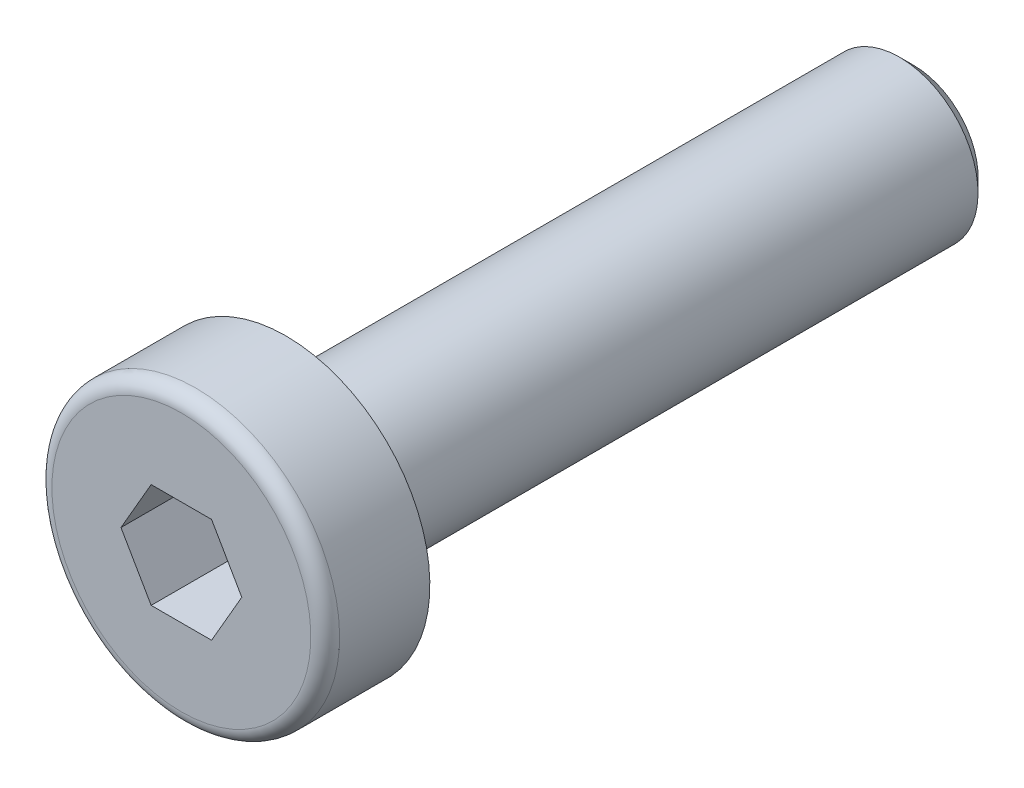
ISO-10303-21;
HEADER;
FILE_DESCRIPTION(('STEP AP214'),'2;1');
FILE_NAME('part.step','',(''),(''),'','','');
FILE_SCHEMA(('AUTOMOTIVE_DESIGN { 1 0 10303 214 1 1 1 1 }'));
ENDSEC;
DATA;
#1=APPLICATION_CONTEXT('core data for automotive mechanical design processes');
#2=APPLICATION_PROTOCOL_DEFINITION('international standard','automotive_design',2000,#1);
#3=PRODUCT_CONTEXT('',#1,'mechanical');
#4=PRODUCT('Part','Part','',(#3));
#5=PRODUCT_RELATED_PRODUCT_CATEGORY('part','',(#4));
#6=PRODUCT_DEFINITION_FORMATION('','',#4);
#7=PRODUCT_DEFINITION_CONTEXT('part definition',#1,'design');
#8=PRODUCT_DEFINITION('design','',#6,#7);
#9=PRODUCT_DEFINITION_SHAPE('','',#8);
#10=(LENGTH_UNIT() NAMED_UNIT(*) SI_UNIT(.MILLI.,.METRE.));
#11=(NAMED_UNIT(*) PLANE_ANGLE_UNIT() SI_UNIT($,.RADIAN.));
#12=(NAMED_UNIT(*) SI_UNIT($,.STERADIAN.) SOLID_ANGLE_UNIT());
#13=UNCERTAINTY_MEASURE_WITH_UNIT(LENGTH_MEASURE(1.E-05),#10,'distance_accuracy_value','');
#14=(GEOMETRIC_REPRESENTATION_CONTEXT(3) GLOBAL_UNCERTAINTY_ASSIGNED_CONTEXT((#13)) GLOBAL_UNIT_ASSIGNED_CONTEXT((#10,
#11,#12)) REPRESENTATION_CONTEXT('',''));
#15=CARTESIAN_POINT('',(0.,0.,0.));
#16=DIRECTION('',(0.,0.,1.));
#17=DIRECTION('',(1.,0.,0.));
#18=AXIS2_PLACEMENT_3D('',#15,#16,#17);
#19=CARTESIAN_POINT('',(0.,1.2375,2.));
#20=DIRECTION('',(0.,0.,1.));
#21=DIRECTION('',(0.,-1.,0.));
#22=AXIS2_PLACEMENT_3D('',#19,#20,#21);
#23=PLANE('',#22);
#24=CARTESIAN_POINT('',(0.,0.,2.));
#25=DIRECTION('',(0.,0.,-1.));
#26=DIRECTION('',(0.,1.,0.));
#27=AXIS2_PLACEMENT_3D('',#24,#25,#26);
#28=CIRCLE('',#27,2.475);
#29=CARTESIAN_POINT('',(0.,2.475,2.));
#30=VERTEX_POINT('',#29);
#31=EDGE_CURVE('E182',#30,#30,#28,.T.);
#32=ORIENTED_EDGE('',*,*,#31,.F.);
#33=EDGE_LOOP('',(#32));
#34=FACE_BOUND('',#33,.T.);
#35=DIRECTION('',(-0.5,0.866025403784439,0.));
#36=VECTOR('',#35,1.);
#37=CARTESIAN_POINT('',(-1.13395160929581,-0.0359372668749457,2.));
#38=LINE('',#37,#36);
#39=CARTESIAN_POINT('',(-0.57735,-0.999999533749891,2.));
#40=VERTEX_POINT('',#39);
#41=CARTESIAN_POINT('',(-1.1547,0.,2.));
#42=VERTEX_POINT('',#41);
#43=EDGE_CURVE('E105',#40,#42,#38,.T.);
#44=ORIENTED_EDGE('',*,*,#43,.T.);
#45=DIRECTION('',(0.5,0.866025403784439,0.));
#46=VECTOR('',#45,1.);
#47=CARTESIAN_POINT('',(-0.59809839070419,0.964062266874946,2.));
#48=LINE('',#47,#46);
#49=CARTESIAN_POINT('',(-0.57735,0.999999533749891,2.));
#50=VERTEX_POINT('',#49);
#51=EDGE_CURVE('E178',#42,#50,#48,.T.);
#52=ORIENTED_EDGE('',*,*,#51,.T.);
#53=DIRECTION('',(1.,0.,0.));
#54=VECTOR('',#53,1.);
#55=CARTESIAN_POINT('',(0.,0.999999533749891,2.));
#56=LINE('',#55,#54);
#57=CARTESIAN_POINT('',(0.57735,0.999999533749891,2.));
#58=VERTEX_POINT('',#57);
#59=EDGE_CURVE('E174',#50,#58,#56,.T.);
#60=ORIENTED_EDGE('',*,*,#59,.T.);
#61=DIRECTION('',(0.5,-0.866025403784439,0.));
#62=VECTOR('',#61,1.);
#63=CARTESIAN_POINT('',(0.598098390704189,0.964062266874946,2.));
#64=LINE('',#63,#62);
#65=CARTESIAN_POINT('',(1.1547,0.,2.));
#66=VERTEX_POINT('',#65);
#67=EDGE_CURVE('E170',#58,#66,#64,.T.);
#68=ORIENTED_EDGE('',*,*,#67,.T.);
#69=DIRECTION('',(-0.5,-0.866025403784439,0.));
#70=VECTOR('',#69,1.);
#71=CARTESIAN_POINT('',(1.13395160929581,-0.0359372668749458,2.));
#72=LINE('',#71,#70);
#73=CARTESIAN_POINT('',(0.57735,-0.999999533749891,2.));
#74=VERTEX_POINT('',#73);
#75=EDGE_CURVE('E108',#66,#74,#72,.T.);
#76=ORIENTED_EDGE('',*,*,#75,.T.);
#77=DIRECTION('',(-1.,0.,0.));
#78=VECTOR('',#77,1.);
#79=CARTESIAN_POINT('',(0.,-0.999999533749891,2.));
#80=LINE('',#79,#78);
#81=EDGE_CURVE('E140',#74,#40,#80,.T.);
#82=ORIENTED_EDGE('',*,*,#81,.T.);
#83=EDGE_LOOP('',(#44,#52,#60,#68,#76,#82));
#84=FACE_BOUND('',#83,.T.);
#85=ADVANCED_FACE('F17',(#34,#84),#23,.T.);
#86=CARTESIAN_POINT('',(0.,0.6146875,-12.));
#87=DIRECTION('',(0.,0.,-1.));
#88=DIRECTION('',(0.,1.,0.));
#89=AXIS2_PLACEMENT_3D('',#86,#87,#88);
#90=PLANE('',#89);
#91=CARTESIAN_POINT('',(0.,0.,-12.));
#92=DIRECTION('',(0.,0.,-1.));
#93=DIRECTION('',(0.,1.,0.));
#94=AXIS2_PLACEMENT_3D('',#91,#92,#93);
#95=CIRCLE('',#94,1.229375);
#96=CARTESIAN_POINT('',(0.,1.229375,-12.));
#97=VERTEX_POINT('',#96);
#98=EDGE_CURVE('E11',#97,#97,#95,.T.);
#99=ORIENTED_EDGE('',*,*,#98,.T.);
#100=EDGE_LOOP('',(#99));
#101=FACE_BOUND('',#100,.T.);
#102=ADVANCED_FACE('F210',(#101),#90,.T.);
#103=CARTESIAN_POINT('',(0.,0.,-11.8646875));
#104=DIRECTION('',(0.,0.,1.));
#105=DIRECTION('',(0.,1.,0.));
#106=AXIS2_PLACEMENT_3D('',#103,#104,#105);
#107=CONICAL_SURFACE('',#106,1.3646875,0.78539816339745);
#108=CARTESIAN_POINT('',(0.,0.,-11.729375));
#109=DIRECTION('',(0.,0.,-1.));
#110=DIRECTION('',(0.,1.,0.));
#111=AXIS2_PLACEMENT_3D('',#108,#109,#110);
#112=CIRCLE('',#111,1.5);
#113=CARTESIAN_POINT('',(0.,1.5,-11.729375));
#114=VERTEX_POINT('',#113);
#115=EDGE_CURVE('E24',#114,#114,#112,.T.);
#116=ORIENTED_EDGE('',*,*,#115,.T.);
#117=EDGE_LOOP('',(#116));
#118=FACE_BOUND('',#117,.T.);
#119=ORIENTED_EDGE('',*,*,#98,.F.);
#120=EDGE_LOOP('',(#119));
#121=FACE_BOUND('',#120,.T.);
#122=ADVANCED_FACE('F215',(#118,#121),#107,.T.);
#123=CARTESIAN_POINT('',(0.,0.,-5.9396875));
#124=DIRECTION('',(0.,0.,1.));
#125=DIRECTION('',(0.,1.,0.));
#126=AXIS2_PLACEMENT_3D('',#123,#124,#125);
#127=CYLINDRICAL_SURFACE('',#126,1.5);
#128=ORIENTED_EDGE('',*,*,#115,.F.);
#129=EDGE_LOOP('',(#128));
#130=FACE_BOUND('',#129,.T.);
#131=CARTESIAN_POINT('',(0.,0.,-0.623736249798327));
#132=DIRECTION('',(0.,0.,-1.));
#133=DIRECTION('',(0.,1.,0.));
#134=AXIS2_PLACEMENT_3D('',#131,#132,#133);
#135=CIRCLE('',#134,1.5);
#136=CARTESIAN_POINT('',(0.,1.5,-0.623736249798327));
#137=VERTEX_POINT('',#136);
#138=EDGE_CURVE('E99',#137,#137,#135,.T.);
#139=ORIENTED_EDGE('',*,*,#138,.T.);
#140=EDGE_LOOP('',(#139));
#141=FACE_BOUND('',#140,.T.);
#142=ADVANCED_FACE('F205',(#130,#141),#127,.T.);
#143=CARTESIAN_POINT('',(0.,0.,-0.15));
#144=DIRECTION('',(0.,0.,-1.));
#145=DIRECTION('',(-1.,0.,0.));
#146=AXIS2_PLACEMENT_3D('',#143,#144,#145);
#147=TOROIDAL_SURFACE('',#146,1.65,0.15);
#148=CARTESIAN_POINT('',(0.,0.,0.));
#149=DIRECTION('',(0.,0.,-1.));
#150=DIRECTION('',(0.,1.,0.));
#151=AXIS2_PLACEMENT_3D('',#148,#149,#150);
#152=CIRCLE('',#151,1.65);
#153=CARTESIAN_POINT('',(0.,1.65,0.));
#154=VERTEX_POINT('',#153);
#155=EDGE_CURVE('E186',#154,#154,#152,.T.);
#156=ORIENTED_EDGE('',*,*,#155,.T.);
#157=EDGE_LOOP('',(#156));
#158=FACE_BOUND('',#157,.T.);
#159=CARTESIAN_POINT('',(0.,0.,-0.15));
#160=DIRECTION('',(0.,0.,-1.));
#161=DIRECTION('',(0.,1.,0.));
#162=AXIS2_PLACEMENT_3D('',#159,#160,#161);
#163=CIRCLE('',#162,1.5);
#164=CARTESIAN_POINT('',(0.,1.5,-0.15));
#165=VERTEX_POINT('',#164);
#166=EDGE_CURVE('E113',#165,#165,#163,.T.);
#167=ORIENTED_EDGE('',*,*,#166,.F.);
#168=EDGE_LOOP('',(#167));
#169=FACE_BOUND('',#168,.T.);
#170=ADVANCED_FACE('F189',(#158,#169),#147,.F.);
#171=CARTESIAN_POINT('',(0.,2.2,0.));
#172=DIRECTION('',(0.,0.,-1.));
#173=DIRECTION('',(0.,1.,0.));
#174=AXIS2_PLACEMENT_3D('',#171,#172,#173);
#175=PLANE('',#174);
#176=CARTESIAN_POINT('',(0.,0.,0.));
#177=DIRECTION('',(0.,0.,-1.));
#178=DIRECTION('',(0.,1.,0.));
#179=AXIS2_PLACEMENT_3D('',#176,#177,#178);
#180=CIRCLE('',#179,2.75);
#181=CARTESIAN_POINT('',(0.,2.75,0.));
#182=VERTEX_POINT('',#181);
#183=EDGE_CURVE('E184',#182,#182,#180,.T.);
#184=ORIENTED_EDGE('',*,*,#183,.T.);
#185=EDGE_LOOP('',(#184));
#186=FACE_BOUND('',#185,.T.);
#187=ORIENTED_EDGE('',*,*,#155,.F.);
#188=EDGE_LOOP('',(#187));
#189=FACE_BOUND('',#188,.T.);
#190=ADVANCED_FACE('F192',(#186,#189),#175,.T.);
#191=CARTESIAN_POINT('',(0.,0.,0.8625));
#192=DIRECTION('',(0.,0.,1.));
#193=DIRECTION('',(0.,1.,0.));
#194=AXIS2_PLACEMENT_3D('',#191,#192,#193);
#195=CYLINDRICAL_SURFACE('',#194,2.75);
#196=CARTESIAN_POINT('',(0.,0.,1.725));
#197=DIRECTION('',(0.,0.,-1.));
#198=DIRECTION('',(0.,1.,0.));
#199=AXIS2_PLACEMENT_3D('',#196,#197,#198);
#200=CIRCLE('',#199,2.75);
#201=CARTESIAN_POINT('',(0.,2.75,1.725));
#202=VERTEX_POINT('',#201);
#203=EDGE_CURVE('E180',#202,#202,#200,.T.);
#204=ORIENTED_EDGE('',*,*,#203,.T.);
#205=EDGE_LOOP('',(#204));
#206=FACE_BOUND('',#205,.T.);
#207=ORIENTED_EDGE('',*,*,#183,.F.);
#208=EDGE_LOOP('',(#207));
#209=FACE_BOUND('',#208,.T.);
#210=ADVANCED_FACE('F194',(#206,#209),#195,.T.);
#211=CARTESIAN_POINT('',(0.,0.,1.725));
#212=DIRECTION('',(0.,0.,-1.));
#213=DIRECTION('',(-1.,0.,0.));
#214=AXIS2_PLACEMENT_3D('',#211,#212,#213);
#215=TOROIDAL_SURFACE('',#214,2.475,0.275);
#216=ORIENTED_EDGE('',*,*,#31,.T.);
#217=EDGE_LOOP('',(#216));
#218=FACE_BOUND('',#217,.T.);
#219=ORIENTED_EDGE('',*,*,#203,.F.);
#220=EDGE_LOOP('',(#219));
#221=FACE_BOUND('',#220,.T.);
#222=ADVANCED_FACE('F202',(#218,#221),#215,.T.);
#223=CARTESIAN_POINT('',(-0.866025,0.499999766874945,2.));
#224=DIRECTION('',(-0.866025403784439,0.5,0.));
#225=DIRECTION('',(0.5,0.866025403784439,0.));
#226=AXIS2_PLACEMENT_3D('',#223,#224,#225);
#227=PLANE('',#226);
#228=CARTESIAN_POINT('',(-1.1547,0.,0.5));
#229=CARTESIAN_POINT('',(-0.866025,0.499999766874946,0.333333411041685));
#230=CARTESIAN_POINT('',(-0.57735,0.999999533749891,0.5));
#231=(BOUNDED_CURVE() B_SPLINE_CURVE(2,(#228,#229,#230),.UNSPECIFIED.,.F.,
.F.) B_SPLINE_CURVE_WITH_KNOTS((3,3),(0.,1.16843559329444),
.UNSPECIFIED.) CURVE() GEOMETRIC_REPRESENTATION_ITEM() RATIONAL_B_SPLINE_CURVE((1.,
1.15470053837925,1.)) REPRESENTATION_ITEM(''));
#232=CARTESIAN_POINT('',(-1.1547,0.,0.5));
#233=VERTEX_POINT('',#232);
#234=CARTESIAN_POINT('',(-0.57735,0.999999533749891,0.5));
#235=VERTEX_POINT('',#234);
#236=EDGE_CURVE('E139',#233,#235,#231,.T.);
#237=ORIENTED_EDGE('',*,*,#236,.T.);
#238=DIRECTION('',(0.,0.,-1.));
#239=VECTOR('',#238,1.);
#240=CARTESIAN_POINT('',(-0.57735,0.999999533749891,2.));
#241=LINE('',#240,#239);
#242=EDGE_CURVE('E176',#50,#235,#241,.T.);
#243=ORIENTED_EDGE('',*,*,#242,.F.);
#244=ORIENTED_EDGE('',*,*,#51,.F.);
#245=DIRECTION('',(0.,0.,-1.));
#246=VECTOR('',#245,1.);
#247=CARTESIAN_POINT('',(-1.1547,0.,2.));
#248=LINE('',#247,#246);
#249=EDGE_CURVE('E104',#42,#233,#248,.T.);
#250=ORIENTED_EDGE('',*,*,#249,.T.);
#251=EDGE_LOOP('',(#237,#243,#244,#250));
#252=FACE_BOUND('',#251,.T.);
#253=ADVANCED_FACE('F228',(#252),#227,.F.);
#254=CARTESIAN_POINT('',(0.,0.999999533749891,2.));
#255=DIRECTION('',(0.,1.,0.));
#256=DIRECTION('',(1.,0.,0.));
#257=AXIS2_PLACEMENT_3D('',#254,#255,#256);
#258=PLANE('',#257);
#259=CARTESIAN_POINT('',(-0.57735,0.999999533749891,0.5));
#260=CARTESIAN_POINT('',(0.,0.999999533749893,0.333333411041685));
#261=CARTESIAN_POINT('',(0.57735,0.999999533749891,0.5));
#262=(BOUNDED_CURVE() B_SPLINE_CURVE(2,(#259,#260,#261),.UNSPECIFIED.,.F.,
.F.) B_SPLINE_CURVE_WITH_KNOTS((3,3),(0.,1.16843559329444),
.UNSPECIFIED.) CURVE() GEOMETRIC_REPRESENTATION_ITEM() RATIONAL_B_SPLINE_CURVE((1.,
1.15470053837925,1.)) REPRESENTATION_ITEM(''));
#263=CARTESIAN_POINT('',(0.57735,0.999999533749891,0.5));
#264=VERTEX_POINT('',#263);
#265=EDGE_CURVE('E123',#235,#264,#262,.T.);
#266=ORIENTED_EDGE('',*,*,#265,.T.);
#267=DIRECTION('',(0.,0.,-1.));
#268=VECTOR('',#267,1.);
#269=CARTESIAN_POINT('',(0.57735,0.999999533749891,2.));
#270=LINE('',#269,#268);
#271=EDGE_CURVE('E172',#58,#264,#270,.T.);
#272=ORIENTED_EDGE('',*,*,#271,.F.);
#273=ORIENTED_EDGE('',*,*,#59,.F.);
#274=ORIENTED_EDGE('',*,*,#242,.T.);
#275=EDGE_LOOP('',(#266,#272,#273,#274));
#276=FACE_BOUND('',#275,.T.);
#277=ADVANCED_FACE('F233',(#276),#258,.F.);
#278=CARTESIAN_POINT('',(0.866025,0.499999766874946,2.));
#279=DIRECTION('',(0.866025403784439,0.5,0.));
#280=DIRECTION('',(0.5,-0.866025403784439,0.));
#281=AXIS2_PLACEMENT_3D('',#278,#279,#280);
#282=PLANE('',#281);
#283=CARTESIAN_POINT('',(0.57735,0.999999533749891,0.5));
#284=CARTESIAN_POINT('',(0.866025,0.499999766874946,0.333333411041685));
#285=CARTESIAN_POINT('',(1.1547,0.,0.5));
#286=(BOUNDED_CURVE() B_SPLINE_CURVE(2,(#283,#284,#285),.UNSPECIFIED.,.F.,
.F.) B_SPLINE_CURVE_WITH_KNOTS((3,3),(0.,1.16843559329444),
.UNSPECIFIED.) CURVE() GEOMETRIC_REPRESENTATION_ITEM() RATIONAL_B_SPLINE_CURVE((1.,
1.15470053837925,1.)) REPRESENTATION_ITEM(''));
#287=CARTESIAN_POINT('',(1.1547,0.,0.5));
#288=VERTEX_POINT('',#287);
#289=EDGE_CURVE('E115',#264,#288,#286,.T.);
#290=ORIENTED_EDGE('',*,*,#289,.T.);
#291=DIRECTION('',(0.,0.,-1.));
#292=VECTOR('',#291,1.);
#293=CARTESIAN_POINT('',(1.1547,0.,2.));
#294=LINE('',#293,#292);
#295=EDGE_CURVE('E110',#66,#288,#294,.T.);
#296=ORIENTED_EDGE('',*,*,#295,.F.);
#297=ORIENTED_EDGE('',*,*,#67,.F.);
#298=ORIENTED_EDGE('',*,*,#271,.T.);
#299=EDGE_LOOP('',(#290,#296,#297,#298));
#300=FACE_BOUND('',#299,.T.);
#301=ADVANCED_FACE('F239',(#300),#282,.F.);
#302=CARTESIAN_POINT('',(0.866025,-0.499999766874946,2.));
#303=DIRECTION('',(0.866025403784439,-0.5,0.));
#304=DIRECTION('',(-0.5,-0.866025403784439,0.));
#305=AXIS2_PLACEMENT_3D('',#302,#303,#304);
#306=PLANE('',#305);
#307=CARTESIAN_POINT('',(1.1547,0.,0.5));
#308=CARTESIAN_POINT('',(0.866025,-0.499999766874945,0.333333411041685));
#309=CARTESIAN_POINT('',(0.57735,-0.999999533749891,0.5));
#310=(BOUNDED_CURVE() B_SPLINE_CURVE(2,(#307,#308,#309),.UNSPECIFIED.,.F.,
.F.) B_SPLINE_CURVE_WITH_KNOTS((3,3),(0.,1.16843559329444),
.UNSPECIFIED.) CURVE() GEOMETRIC_REPRESENTATION_ITEM() RATIONAL_B_SPLINE_CURVE((1.,
1.15470053837925,1.)) REPRESENTATION_ITEM(''));
#311=CARTESIAN_POINT('',(0.57735,-0.999999533749891,0.5));
#312=VERTEX_POINT('',#311);
#313=EDGE_CURVE('E106',#288,#312,#310,.T.);
#314=ORIENTED_EDGE('',*,*,#313,.T.);
#315=DIRECTION('',(0.,0.,-1.));
#316=VECTOR('',#315,1.);
#317=CARTESIAN_POINT('',(0.57735,-0.999999533749891,2.));
#318=LINE('',#317,#316);
#319=EDGE_CURVE('E111',#74,#312,#318,.T.);
#320=ORIENTED_EDGE('',*,*,#319,.F.);
#321=ORIENTED_EDGE('',*,*,#75,.F.);
#322=ORIENTED_EDGE('',*,*,#295,.T.);
#323=EDGE_LOOP('',(#314,#320,#321,#322));
#324=FACE_BOUND('',#323,.T.);
#325=ADVANCED_FACE('F243',(#324),#306,.F.);
#326=CARTESIAN_POINT('',(0.,-0.999999533749891,2.));
#327=DIRECTION('',(0.,-1.,0.));
#328=DIRECTION('',(-1.,0.,0.));
#329=AXIS2_PLACEMENT_3D('',#326,#327,#328);
#330=PLANE('',#329);
#331=CARTESIAN_POINT('',(0.57735,-0.999999533749891,0.5));
#332=CARTESIAN_POINT('',(0.,-0.999999533749893,0.333333411041685));
#333=CARTESIAN_POINT('',(-0.57735,-0.999999533749891,0.5));
#334=(BOUNDED_CURVE() B_SPLINE_CURVE(2,(#331,#332,#333),.UNSPECIFIED.,.F.,
.F.) B_SPLINE_CURVE_WITH_KNOTS((3,3),(0.,1.16843559329444),
.UNSPECIFIED.) CURVE() GEOMETRIC_REPRESENTATION_ITEM() RATIONAL_B_SPLINE_CURVE((1.,
1.15470053837925,1.)) REPRESENTATION_ITEM(''));
#335=CARTESIAN_POINT('',(-0.57735,-0.999999533749892,0.5));
#336=VERTEX_POINT('',#335);
#337=EDGE_CURVE('E131',#312,#336,#334,.T.);
#338=ORIENTED_EDGE('',*,*,#337,.T.);
#339=DIRECTION('',(0.,0.,-1.));
#340=VECTOR('',#339,1.);
#341=CARTESIAN_POINT('',(-0.57735,-0.999999533749891,2.));
#342=LINE('',#341,#340);
#343=EDGE_CURVE('E118',#40,#336,#342,.T.);
#344=ORIENTED_EDGE('',*,*,#343,.F.);
#345=ORIENTED_EDGE('',*,*,#81,.F.);
#346=ORIENTED_EDGE('',*,*,#319,.T.);
#347=EDGE_LOOP('',(#338,#344,#345,#346));
#348=FACE_BOUND('',#347,.T.);
#349=ADVANCED_FACE('F246',(#348),#330,.F.);
#350=CARTESIAN_POINT('',(-0.866025,-0.499999766874946,2.));
#351=DIRECTION('',(-0.866025403784439,-0.5,0.));
#352=DIRECTION('',(-0.5,0.866025403784439,0.));
#353=AXIS2_PLACEMENT_3D('',#350,#351,#352);
#354=PLANE('',#353);
#355=CARTESIAN_POINT('',(-0.57735,-0.999999533749891,0.5));
#356=CARTESIAN_POINT('',(-0.866025,-0.499999766874945,0.333333411041685));
#357=CARTESIAN_POINT('',(-1.1547,0.,0.5));
#358=(BOUNDED_CURVE() B_SPLINE_CURVE(2,(#355,#356,#357),.UNSPECIFIED.,.F.,
.F.) B_SPLINE_CURVE_WITH_KNOTS((3,3),(0.,1.16843559329444),
.UNSPECIFIED.) CURVE() GEOMETRIC_REPRESENTATION_ITEM() RATIONAL_B_SPLINE_CURVE((1.,
1.15470053837925,1.)) REPRESENTATION_ITEM(''));
#359=EDGE_CURVE('E149',#336,#233,#358,.T.);
#360=ORIENTED_EDGE('',*,*,#359,.T.);
#361=ORIENTED_EDGE('',*,*,#249,.F.);
#362=ORIENTED_EDGE('',*,*,#43,.F.);
#363=ORIENTED_EDGE('',*,*,#343,.T.);
#364=EDGE_LOOP('',(#360,#361,#362,#363));
#365=FACE_BOUND('',#364,.T.);
#366=ADVANCED_FACE('F224',(#365),#354,.F.);
#367=CARTESIAN_POINT('',(0.,0.,0.166666822083369));
#368=DIRECTION('',(0.,0.,1.));
#369=DIRECTION('',(0.,1.,0.));
#370=AXIS2_PLACEMENT_3D('',#367,#368,#369);
#371=CONICAL_SURFACE('',#370,0.57735,1.0471975511966);
#372=CARTESIAN_POINT('',(0.,0.,-0.166666355833261));
#373=VERTEX_POINT('',#372);
#374=VERTEX_LOOP('',#373);
#375=FACE_BOUND('',#374,.T.);
#376=ORIENTED_EDGE('',*,*,#289,.F.);
#377=ORIENTED_EDGE('',*,*,#265,.F.);
#378=ORIENTED_EDGE('',*,*,#236,.F.);
#379=ORIENTED_EDGE('',*,*,#359,.F.);
#380=ORIENTED_EDGE('',*,*,#337,.F.);
#381=ORIENTED_EDGE('',*,*,#313,.F.);
#382=EDGE_LOOP('',(#376,#377,#378,#379,#380,#381));
#383=FACE_BOUND('',#382,.T.);
#384=ADVANCED_FACE('F248',(#375,#383),#371,.F.);
#385=CARTESIAN_POINT('',(0.,0.,-5.9396875));
#386=DIRECTION('',(0.,0.,1.));
#387=DIRECTION('',(0.,1.,0.));
#388=AXIS2_PLACEMENT_3D('',#385,#386,#387);
#389=CYLINDRICAL_SURFACE('',#388,1.5);
#390=ORIENTED_EDGE('',*,*,#166,.T.);
#391=EDGE_LOOP('',(#390));
#392=FACE_BOUND('',#391,.T.);
#393=CARTESIAN_POINT('',(0.,0.,-0.155));
#394=DIRECTION('',(0.,0.,1.));
#395=DIRECTION('',(0.,1.,0.));
#396=AXIS2_PLACEMENT_3D('',#393,#394,#395);
#397=CIRCLE('',#396,1.5);
#398=CARTESIAN_POINT('',(0.,1.5,-0.155));
#399=VERTEX_POINT('',#398);
#400=EDGE_CURVE('E101',#399,#399,#397,.T.);
#401=ORIENTED_EDGE('',*,*,#400,.T.);
#402=EDGE_LOOP('',(#401));
#403=FACE_BOUND('',#402,.T.);
#404=ADVANCED_FACE('F250',(#392,#403),#389,.T.);
#405=CARTESIAN_POINT('',(0.,0.,-0.389368124899163));
#406=DIRECTION('',(0.,0.,1.));
#407=DIRECTION('',(0.,1.,0.));
#408=AXIS2_PLACEMENT_3D('',#405,#406,#407);
#409=CONICAL_SURFACE('',#408,1.3646875,0.523598775598299);
#410=CARTESIAN_POINT('',(0.,0.,-0.623736249798327));
#411=DIRECTION('',(0.,0.,-1.));
#412=DIRECTION('',(0.,1.,0.));
#413=AXIS2_PLACEMENT_3D('',#410,#411,#412);
#414=CIRCLE('',#413,1.229375);
#415=CARTESIAN_POINT('',(0.,1.229375,-0.623736249798327));
#416=VERTEX_POINT('',#415);
#417=EDGE_CURVE('E96',#416,#416,#414,.T.);
#418=ORIENTED_EDGE('',*,*,#417,.F.);
#419=EDGE_LOOP('',(#418));
#420=FACE_BOUND('',#419,.T.);
#421=ORIENTED_EDGE('',*,*,#400,.F.);
#422=EDGE_LOOP('',(#421));
#423=FACE_BOUND('',#422,.T.);
#424=ADVANCED_FACE('F257',(#420,#423),#409,.T.);
#425=CARTESIAN_POINT('',(0.,1.3646875,-0.623736249798327));
#426=DIRECTION('',(0.,0.,-1.));
#427=DIRECTION('',(0.,1.,0.));
#428=AXIS2_PLACEMENT_3D('',#425,#426,#427);
#429=PLANE('',#428);
#430=ORIENTED_EDGE('',*,*,#138,.F.);
#431=EDGE_LOOP('',(#430));
#432=FACE_BOUND('',#431,.T.);
#433=ORIENTED_EDGE('',*,*,#417,.T.);
#434=EDGE_LOOP('',(#433));
#435=FACE_BOUND('',#434,.T.);
#436=ADVANCED_FACE('F97',(#432,#435),#429,.F.);
#437=CLOSED_SHELL('',(#85,#102,#122,#142,#170,#190,#210,#222,#253,#277,#301,#325,#349,#366,#384,
#404,#424,#436));
#438=MANIFOLD_SOLID_BREP('B1',#437);
#439=ADVANCED_BREP_SHAPE_REPRESENTATION('',(#18,#438),#14);
#440=SHAPE_DEFINITION_REPRESENTATION(#9,#439);
ENDSEC;
END-ISO-10303-21;
